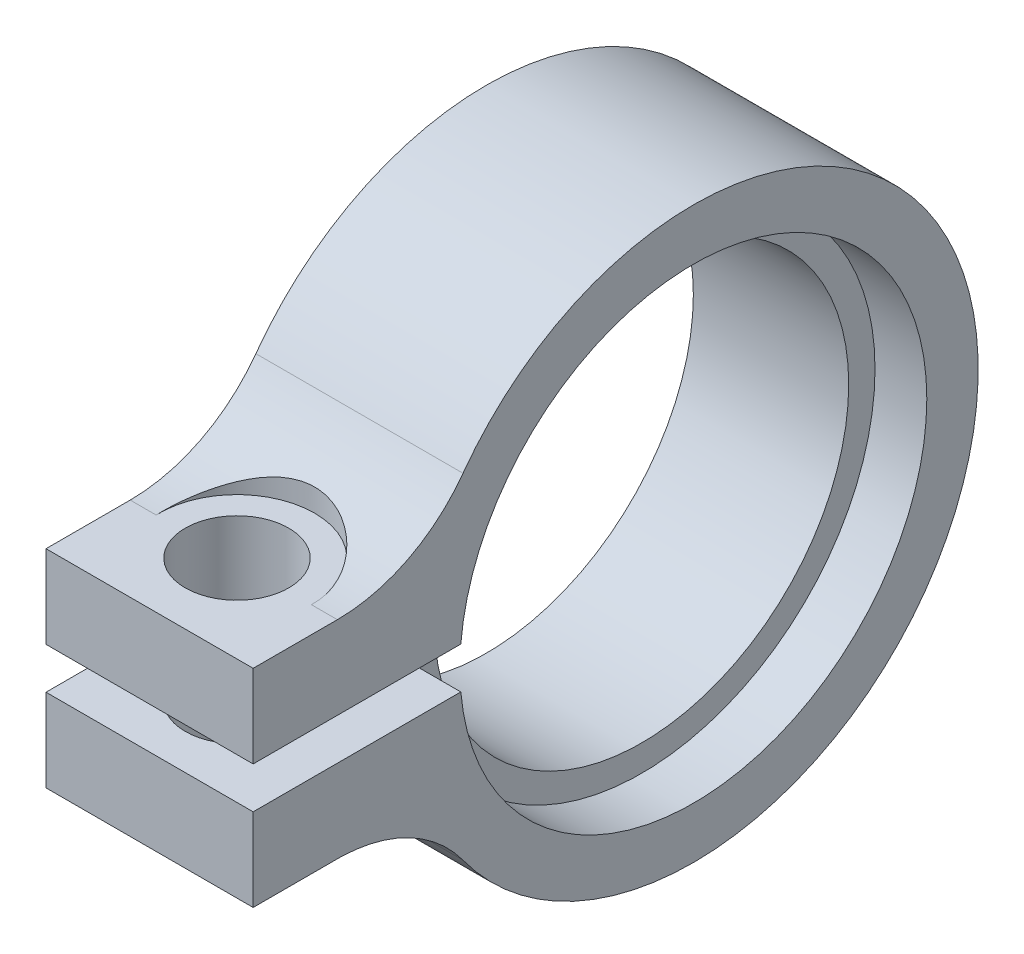
ISO-10303-21;
HEADER;
FILE_DESCRIPTION(('STEP AP214'),'2;1');
FILE_NAME('part.step','',(''),(''),'','','');
FILE_SCHEMA(('AUTOMOTIVE_DESIGN { 1 0 10303 214 1 1 1 1 }'));
ENDSEC;
DATA;
#1=APPLICATION_CONTEXT('core data for automotive mechanical design processes');
#2=APPLICATION_PROTOCOL_DEFINITION('international standard','automotive_design',2000,#1);
#3=PRODUCT_CONTEXT('',#1,'mechanical');
#4=PRODUCT('Part','Part','',(#3));
#5=PRODUCT_RELATED_PRODUCT_CATEGORY('part','',(#4));
#6=PRODUCT_DEFINITION_FORMATION('','',#4);
#7=PRODUCT_DEFINITION_CONTEXT('part definition',#1,'design');
#8=PRODUCT_DEFINITION('design','',#6,#7);
#9=PRODUCT_DEFINITION_SHAPE('','',#8);
#10=(LENGTH_UNIT() NAMED_UNIT(*) SI_UNIT(.MILLI.,.METRE.));
#11=(NAMED_UNIT(*) PLANE_ANGLE_UNIT() SI_UNIT($,.RADIAN.));
#12=(NAMED_UNIT(*) SI_UNIT($,.STERADIAN.) SOLID_ANGLE_UNIT());
#13=UNCERTAINTY_MEASURE_WITH_UNIT(LENGTH_MEASURE(1.E-05),#10,'distance_accuracy_value','');
#14=(GEOMETRIC_REPRESENTATION_CONTEXT(3) GLOBAL_UNCERTAINTY_ASSIGNED_CONTEXT((#13)) GLOBAL_UNIT_ASSIGNED_CONTEXT((#10,
#11,#12)) REPRESENTATION_CONTEXT('',''));
#15=CARTESIAN_POINT('',(0.,0.,0.));
#16=DIRECTION('',(0.,0.,1.));
#17=DIRECTION('',(1.,0.,0.));
#18=AXIS2_PLACEMENT_3D('',#15,#16,#17);
#19=CARTESIAN_POINT('',(-60.325,0.,0.));
#20=DIRECTION('',(-1.,0.,0.));
#21=DIRECTION('',(0.,0.,1.));
#22=AXIS2_PLACEMENT_3D('',#19,#20,#21);
#23=PLANE('',#22);
#24=DIRECTION('',(0.,0.,-1.));
#25=VECTOR('',#24,1.);
#26=CARTESIAN_POINT('',(-60.325,181.1,0.));
#27=LINE('',#26,#25);
#28=CARTESIAN_POINT('',(-60.325,181.1,21.741244542418));
#29=VERTEX_POINT('',#28);
#30=CARTESIAN_POINT('',(-60.325,181.1,21.5132897985428));
#31=VERTEX_POINT('',#30);
#32=EDGE_CURVE('E188',#29,#31,#27,.T.);
#33=ORIENTED_EDGE('',*,*,#32,.F.);
#34=DIRECTION('',(0.,1.,0.));
#35=VECTOR('',#34,1.);
#36=CARTESIAN_POINT('',(-60.325,169.9875,21.741244542418));
#37=LINE('',#36,#35);
#38=CARTESIAN_POINT('',(-60.325,181.09963598989,21.741244542418));
#39=VERTEX_POINT('',#38);
#40=EDGE_CURVE('E171',#39,#29,#37,.T.);
#41=ORIENTED_EDGE('',*,*,#40,.F.);
#42=CARTESIAN_POINT('',(-60.325,171.575,21.8245167472272));
#43=DIRECTION('',(-1.,0.,0.));
#44=DIRECTION('',(0.,0.,1.));
#45=AXIS2_PLACEMENT_3D('',#42,#43,#44);
#46=CIRCLE('',#45,9.525);
#47=CARTESIAN_POINT('',(-60.325,181.1,21.8245167472272));
#48=VERTEX_POINT('',#47);
#49=EDGE_CURVE('E318',#39,#48,#46,.F.);
#50=ORIENTED_EDGE('',*,*,#49,.T.);
#51=DIRECTION('',(0.,0.,-1.));
#52=VECTOR('',#51,1.);
#53=CARTESIAN_POINT('',(-60.325,181.1,0.));
#54=LINE('',#53,#52);
#55=CARTESIAN_POINT('',(-60.325,181.1,26.9875));
#56=VERTEX_POINT('',#55);
#57=EDGE_CURVE('E278',#56,#48,#54,.T.);
#58=ORIENTED_EDGE('',*,*,#57,.F.);
#59=DIRECTION('',(0.,-1.,0.));
#60=VECTOR('',#59,1.);
#61=CARTESIAN_POINT('',(-60.325,0.,26.9875));
#62=LINE('',#61,#60);
#63=CARTESIAN_POINT('',(-60.325,186.18,26.9875));
#64=VERTEX_POINT('',#63);
#65=EDGE_CURVE('E280',#64,#56,#62,.T.);
#66=ORIENTED_EDGE('',*,*,#65,.F.);
#67=DIRECTION('',(0.,0.,1.));
#68=VECTOR('',#67,1.);
#69=CARTESIAN_POINT('',(-60.325,186.18,0.));
#70=LINE('',#69,#68);
#71=CARTESIAN_POINT('',(-60.325,186.18,12.6363404512541));
#72=VERTEX_POINT('',#71);
#73=EDGE_CURVE('E283',#72,#64,#70,.T.);
#74=ORIENTED_EDGE('',*,*,#73,.F.);
#75=CARTESIAN_POINT('',(-60.325,187.45,0.));
#76=DIRECTION('',(-1.,0.,0.));
#77=DIRECTION('',(0.,0.,1.));
#78=AXIS2_PLACEMENT_3D('',#75,#76,#77);
#79=CIRCLE('',#78,12.7);
#80=CARTESIAN_POINT('',(-60.325,188.72,12.6363404512541));
#81=VERTEX_POINT('',#80);
#82=EDGE_CURVE('E265',#72,#81,#79,.F.);
#83=ORIENTED_EDGE('',*,*,#82,.T.);
#84=DIRECTION('',(0.,0.,1.));
#85=VECTOR('',#84,1.);
#86=CARTESIAN_POINT('',(-60.325,188.72,0.));
#87=LINE('',#86,#85);
#88=CARTESIAN_POINT('',(-60.325,188.72,26.9875));
#89=VERTEX_POINT('',#88);
#90=EDGE_CURVE('E268',#81,#89,#87,.T.);
#91=ORIENTED_EDGE('',*,*,#90,.T.);
#92=DIRECTION('',(0.,1.,0.));
#93=VECTOR('',#92,1.);
#94=CARTESIAN_POINT('',(-60.325,0.,26.9875));
#95=LINE('',#94,#93);
#96=CARTESIAN_POINT('',(-60.325,193.8,26.9875));
#97=VERTEX_POINT('',#96);
#98=EDGE_CURVE('E271',#89,#97,#95,.T.);
#99=ORIENTED_EDGE('',*,*,#98,.T.);
#100=DIRECTION('',(0.,0.,-1.));
#101=VECTOR('',#100,1.);
#102=CARTESIAN_POINT('',(-60.325,193.8,0.));
#103=LINE('',#102,#101);
#104=CARTESIAN_POINT('',(-60.325,193.8,21.8245167472272));
#105=VERTEX_POINT('',#104);
#106=EDGE_CURVE('E273',#97,#105,#103,.T.);
#107=ORIENTED_EDGE('',*,*,#106,.T.);
#108=CARTESIAN_POINT('',(-60.325,203.325,21.8245167472272));
#109=DIRECTION('',(-1.,0.,0.));
#110=DIRECTION('',(0.,0.,1.));
#111=AXIS2_PLACEMENT_3D('',#108,#109,#110);
#112=CIRCLE('',#111,9.525);
#113=CARTESIAN_POINT('',(-60.325,197.722058823529,14.1217461305588));
#114=VERTEX_POINT('',#113);
#115=EDGE_CURVE('E323',#105,#114,#112,.F.);
#116=ORIENTED_EDGE('',*,*,#115,.T.);
#117=CARTESIAN_POINT('',(-60.325,187.45,0.));
#118=DIRECTION('',(-1.,0.,0.));
#119=DIRECTION('',(0.,0.,1.));
#120=AXIS2_PLACEMENT_3D('',#117,#118,#119);
#121=CIRCLE('',#120,17.4625);
#122=CARTESIAN_POINT('',(-60.325,177.177941176471,14.1217461305588));
#123=VERTEX_POINT('',#122);
#124=EDGE_CURVE('E275',#114,#123,#121,.T.);
#125=ORIENTED_EDGE('',*,*,#124,.T.);
#126=CARTESIAN_POINT('',(-60.325,181.094914011503,21.5132897985428));
#127=VERTEX_POINT('',#126);
#128=EDGE_CURVE('E319',#123,#127,#46,.F.);
#129=ORIENTED_EDGE('',*,*,#128,.T.);
#130=DIRECTION('',(0.,1.,0.));
#131=VECTOR('',#130,1.);
#132=CARTESIAN_POINT('',(-60.325,169.9875,21.5132897985428));
#133=LINE('',#132,#131);
#134=EDGE_CURVE('E180',#127,#31,#133,.T.);
#135=ORIENTED_EDGE('',*,*,#134,.T.);
#136=EDGE_LOOP('',(#33,#41,#50,#58,#66,#74,#83,#91,#99,#107,#116,#125,#129,#135));
#137=FACE_BOUND('',#136,.T.);
#138=ADVANCED_FACE('F35',(#137),#23,.T.);
#139=CARTESIAN_POINT('',(-47.625,187.45,0.));
#140=DIRECTION('',(1.,0.,0.));
#141=DIRECTION('',(0.,0.,-1.));
#142=AXIS2_PLACEMENT_3D('',#139,#140,#141);
#143=PLANE('',#142);
#144=CARTESIAN_POINT('',(-47.625,171.575,21.8245167472272));
#145=DIRECTION('',(1.,0.,0.));
#146=DIRECTION('',(0.,0.,-1.));
#147=AXIS2_PLACEMENT_3D('',#144,#145,#146);
#148=CIRCLE('',#147,9.525);
#149=CARTESIAN_POINT('',(-47.625,181.1,21.8245167472272));
#150=VERTEX_POINT('',#149);
#151=CARTESIAN_POINT('',(-47.625,181.09963598989,21.7412445424181));
#152=VERTEX_POINT('',#151);
#153=EDGE_CURVE('E315',#150,#152,#148,.F.);
#154=ORIENTED_EDGE('',*,*,#153,.T.);
#155=DIRECTION('',(0.,1.,0.));
#156=VECTOR('',#155,1.);
#157=CARTESIAN_POINT('',(-47.625,169.9875,21.7412445424181));
#158=LINE('',#157,#156);
#159=CARTESIAN_POINT('',(-47.625,181.1,21.7412445424181));
#160=VERTEX_POINT('',#159);
#161=EDGE_CURVE('E210',#152,#160,#158,.T.);
#162=ORIENTED_EDGE('',*,*,#161,.T.);
#163=DIRECTION('',(0.,0.,1.));
#164=VECTOR('',#163,1.);
#165=CARTESIAN_POINT('',(-47.625,181.1,0.));
#166=LINE('',#165,#164);
#167=CARTESIAN_POINT('',(-47.625,181.1,21.5132897985427));
#168=VERTEX_POINT('',#167);
#169=EDGE_CURVE('E208',#168,#160,#166,.T.);
#170=ORIENTED_EDGE('',*,*,#169,.F.);
#171=DIRECTION('',(0.,1.,0.));
#172=VECTOR('',#171,1.);
#173=CARTESIAN_POINT('',(-47.625,169.9875,21.5132897985427));
#174=LINE('',#173,#172);
#175=CARTESIAN_POINT('',(-47.625,181.094914011503,21.5132897985427));
#176=VERTEX_POINT('',#175);
#177=EDGE_CURVE('E213',#176,#168,#174,.T.);
#178=ORIENTED_EDGE('',*,*,#177,.F.);
#179=CARTESIAN_POINT('',(-47.625,177.177941176471,14.1217461305588));
#180=VERTEX_POINT('',#179);
#181=EDGE_CURVE('E314',#176,#180,#148,.F.);
#182=ORIENTED_EDGE('',*,*,#181,.T.);
#183=CARTESIAN_POINT('',(-47.625,187.45,0.));
#184=DIRECTION('',(1.,0.,0.));
#185=DIRECTION('',(0.,0.,-1.));
#186=AXIS2_PLACEMENT_3D('',#183,#184,#185);
#187=CIRCLE('',#186,17.4625);
#188=CARTESIAN_POINT('',(-47.625,197.722058823529,14.1217461305588));
#189=VERTEX_POINT('',#188);
#190=EDGE_CURVE('E255',#189,#180,#187,.F.);
#191=ORIENTED_EDGE('',*,*,#190,.F.);
#192=CARTESIAN_POINT('',(-47.625,203.325,21.8245167472272));
#193=DIRECTION('',(1.,0.,0.));
#194=DIRECTION('',(0.,0.,-1.));
#195=AXIS2_PLACEMENT_3D('',#192,#193,#194);
#196=CIRCLE('',#195,9.525);
#197=CARTESIAN_POINT('',(-47.625,193.8,21.8245167472272));
#198=VERTEX_POINT('',#197);
#199=EDGE_CURVE('E321',#189,#198,#196,.F.);
#200=ORIENTED_EDGE('',*,*,#199,.T.);
#201=DIRECTION('',(0.,0.,-1.));
#202=VECTOR('',#201,1.);
#203=CARTESIAN_POINT('',(-47.625,193.8,0.));
#204=LINE('',#203,#202);
#205=CARTESIAN_POINT('',(-47.625,193.8,26.9875));
#206=VERTEX_POINT('',#205);
#207=EDGE_CURVE('E241',#206,#198,#204,.T.);
#208=ORIENTED_EDGE('',*,*,#207,.F.);
#209=DIRECTION('',(0.,1.,0.));
#210=VECTOR('',#209,1.);
#211=CARTESIAN_POINT('',(-47.625,0.,26.9875));
#212=LINE('',#211,#210);
#213=CARTESIAN_POINT('',(-47.625,188.72,26.9875));
#214=VERTEX_POINT('',#213);
#215=EDGE_CURVE('E238',#214,#206,#212,.T.);
#216=ORIENTED_EDGE('',*,*,#215,.F.);
#217=DIRECTION('',(0.,0.,1.));
#218=VECTOR('',#217,1.);
#219=CARTESIAN_POINT('',(-47.625,188.72,0.));
#220=LINE('',#219,#218);
#221=CARTESIAN_POINT('',(-47.625,188.72,14.2564443817524));
#222=VERTEX_POINT('',#221);
#223=EDGE_CURVE('E236',#222,#214,#220,.T.);
#224=ORIENTED_EDGE('',*,*,#223,.F.);
#225=CARTESIAN_POINT('',(-47.625,187.45,0.));
#226=DIRECTION('',(1.,0.,0.));
#227=DIRECTION('',(0.,0.,-1.));
#228=AXIS2_PLACEMENT_3D('',#225,#226,#227);
#229=CIRCLE('',#228,14.3129);
#230=CARTESIAN_POINT('',(-47.625,186.18,14.2564443817524));
#231=VERTEX_POINT('',#230);
#232=EDGE_CURVE('E232',#222,#231,#229,.F.);
#233=ORIENTED_EDGE('',*,*,#232,.T.);
#234=DIRECTION('',(0.,0.,1.));
#235=VECTOR('',#234,1.);
#236=CARTESIAN_POINT('',(-47.625,186.18,0.));
#237=LINE('',#236,#235);
#238=CARTESIAN_POINT('',(-47.625,186.18,26.9875));
#239=VERTEX_POINT('',#238);
#240=EDGE_CURVE('E247',#231,#239,#237,.T.);
#241=ORIENTED_EDGE('',*,*,#240,.T.);
#242=DIRECTION('',(0.,-1.,0.));
#243=VECTOR('',#242,1.);
#244=CARTESIAN_POINT('',(-47.625,0.,26.9875));
#245=LINE('',#244,#243);
#246=CARTESIAN_POINT('',(-47.625,181.1,26.9875));
#247=VERTEX_POINT('',#246);
#248=EDGE_CURVE('E250',#239,#247,#245,.T.);
#249=ORIENTED_EDGE('',*,*,#248,.T.);
#250=DIRECTION('',(0.,0.,-1.));
#251=VECTOR('',#250,1.);
#252=CARTESIAN_POINT('',(-47.625,181.1,0.));
#253=LINE('',#252,#251);
#254=EDGE_CURVE('E242',#247,#150,#253,.T.);
#255=ORIENTED_EDGE('',*,*,#254,.T.);
#256=EDGE_LOOP('',(#154,#162,#170,#178,#182,#191,#200,#208,#216,#224,#233,#241,#249,#255));
#257=FACE_BOUND('',#256,.T.);
#258=ADVANCED_FACE('F348',(#257),#143,.T.);
#259=CARTESIAN_POINT('',(-60.325,171.575,21.8245167472272));
#260=DIRECTION('',(1.,0.,0.));
#261=DIRECTION('',(0.,0.,-1.));
#262=AXIS2_PLACEMENT_3D('',#259,#260,#261);
#263=CYLINDRICAL_SURFACE('',#262,9.525);
#264=CARTESIAN_POINT('',(-47.6730772298625,171.575,21.8245167472272));
#265=DIRECTION('',(-0.866025403784439,0.,-0.5));
#266=DIRECTION('',(0.5,0.,-0.866025403784439));
#267=AXIS2_PLACEMENT_3D('',#264,#265,#266);
#268=ELLIPSE('',#267,10.9985226280624,9.525);
#269=CARTESIAN_POINT('',(-47.6730772298626,181.1,21.8245167472272));
#270=VERTEX_POINT('',#269);
#271=EDGE_CURVE('E11',#152,#270,#268,.F.);
#272=ORIENTED_EDGE('',*,*,#271,.F.);
#273=ORIENTED_EDGE('',*,*,#153,.F.);
#274=DIRECTION('',(1.,0.,0.));
#275=VECTOR('',#274,1.);
#276=CARTESIAN_POINT('',(-60.325,181.1,21.8245167472272));
#277=LINE('',#276,#275);
#278=EDGE_CURVE('E305',#270,#150,#277,.T.);
#279=ORIENTED_EDGE('',*,*,#278,.F.);
#280=EDGE_LOOP('',(#272,#273,#279));
#281=FACE_BOUND('',#280,.T.);
#282=ADVANCED_FACE('F351',(#281),#263,.F.);
#283=CARTESIAN_POINT('',(-60.2769227701374,171.575,21.8245167472272));
#284=DIRECTION('',(0.866025403784439,0.,-0.499999999999999));
#285=DIRECTION('',(0.499999999999999,0.,0.866025403784439));
#286=AXIS2_PLACEMENT_3D('',#283,#284,#285);
#287=ELLIPSE('',#286,10.9985226280624,9.525);
#288=CARTESIAN_POINT('',(-60.2769227701374,181.1,21.8245167472272));
#289=VERTEX_POINT('',#288);
#290=EDGE_CURVE('E44',#289,#39,#287,.F.);
#291=ORIENTED_EDGE('',*,*,#290,.F.);
#292=EDGE_CURVE('E192',#48,#289,#277,.T.);
#293=ORIENTED_EDGE('',*,*,#292,.F.);
#294=ORIENTED_EDGE('',*,*,#49,.F.);
#295=EDGE_LOOP('',(#291,#293,#294));
#296=FACE_BOUND('',#295,.T.);
#297=ADVANCED_FACE('F388',(#296),#263,.F.);
#298=CARTESIAN_POINT('',(-60.504686962602,171.575,21.8245167472272));
#299=DIRECTION('',(0.866025403784439,0.,0.5));
#300=DIRECTION('',(0.5,0.,-0.866025403784439));
#301=AXIS2_PLACEMENT_3D('',#298,#299,#300);
#302=ELLIPSE('',#301,10.9985226280624,9.525);
#303=CARTESIAN_POINT('',(-57.2960729993275,179.310632766881,16.2670343409609));
#304=VERTEX_POINT('',#303);
#305=EDGE_CURVE('E405',#127,#304,#302,.F.);
#306=ORIENTED_EDGE('',*,*,#305,.F.);
#307=ORIENTED_EDGE('',*,*,#128,.F.);
#308=DIRECTION('',(1.,0.,0.));
#309=VECTOR('',#308,1.);
#310=CARTESIAN_POINT('',(-60.325,177.177941176471,14.1217461305588));
#311=LINE('',#310,#309);
#312=EDGE_CURVE('E310',#180,#123,#311,.F.);
#313=ORIENTED_EDGE('',*,*,#312,.F.);
#314=ORIENTED_EDGE('',*,*,#181,.F.);
#315=CARTESIAN_POINT('',(-47.445313037398,171.575,21.8245167472272));
#316=DIRECTION('',(-0.866025403784438,0.,0.5));
#317=DIRECTION('',(0.5,0.,0.866025403784439));
#318=AXIS2_PLACEMENT_3D('',#315,#316,#317);
#319=ELLIPSE('',#318,10.9985226280624,9.525);
#320=CARTESIAN_POINT('',(-50.6539270006725,179.310632766881,16.2670343409609));
#321=VERTEX_POINT('',#320);
#322=EDGE_CURVE('E332',#321,#176,#319,.F.);
#323=ORIENTED_EDGE('',*,*,#322,.F.);
#324=DIRECTION('',(1.,0.,0.));
#325=VECTOR('',#324,1.);
#326=CARTESIAN_POINT('',(-60.325,179.310632766881,16.2670343409609));
#327=LINE('',#326,#325);
#328=EDGE_CURVE('E408',#304,#321,#327,.T.);
#329=ORIENTED_EDGE('',*,*,#328,.F.);
#330=EDGE_LOOP('',(#306,#307,#313,#314,#323,#329));
#331=FACE_BOUND('',#330,.T.);
#332=ADVANCED_FACE('F390',(#331),#263,.F.);
#333=CARTESIAN_POINT('',(-53.975,169.9875,21.6272671704804));
#334=DIRECTION('',(0.,1.,0.));
#335=DIRECTION('',(0.,0.,1.));
#336=AXIS2_PLACEMENT_3D('',#333,#334,#335);
#337=CYLINDRICAL_SURFACE('',#336,3.175);
#338=CARTESIAN_POINT('',(-53.975,186.18,21.6272671704804));
#339=DIRECTION('',(0.,1.,0.));
#340=DIRECTION('',(0.,0.,1.));
#341=AXIS2_PLACEMENT_3D('',#338,#339,#340);
#342=CIRCLE('',#341,3.175);
#343=CARTESIAN_POINT('',(-53.975,186.18,24.8022671704804));
#344=VERTEX_POINT('',#343);
#345=EDGE_CURVE('E225',#344,#344,#342,.T.);
#346=CARTESIAN_POINT('',(-53.975,181.1,21.6272671704804));
#347=DIRECTION('',(0.,-1.,0.));
#348=DIRECTION('',(0.,0.,-1.));
#349=AXIS2_PLACEMENT_3D('',#346,#347,#348);
#350=CIRCLE('',#349,3.175);
#351=CARTESIAN_POINT('',(-53.975,181.1,24.8022671704804));
#352=VERTEX_POINT('',#351);
#353=EDGE_CURVE('E222',#352,#352,#350,.T.);
#354=CARTESIAN_POINT('',(-53.975,186.18,24.8022671704804));
#355=CARTESIAN_POINT('',(-53.975,186.127083333333,24.8022671704804));
#356=CARTESIAN_POINT('',(-53.975,186.074166666667,24.8022671704804));
#357=CARTESIAN_POINT('',(-53.975,185.968333333333,24.8022671704804));
#358=CARTESIAN_POINT('',(-53.975,185.915416666667,24.8022671704804));
#359=CARTESIAN_POINT('',(-53.975,185.809583333333,24.8022671704804));
#360=CARTESIAN_POINT('',(-53.975,185.756666666667,24.8022671704804));
#361=CARTESIAN_POINT('',(-53.975,185.650833333333,24.8022671704804));
#362=CARTESIAN_POINT('',(-53.975,185.597916666667,24.8022671704804));
#363=CARTESIAN_POINT('',(-53.975,185.492083333333,24.8022671704804));
#364=CARTESIAN_POINT('',(-53.975,185.439166666667,24.8022671704804));
#365=CARTESIAN_POINT('',(-53.975,185.333333333333,24.8022671704804));
#366=CARTESIAN_POINT('',(-53.975,185.280416666667,24.8022671704804));
#367=CARTESIAN_POINT('',(-53.975,185.174583333333,24.8022671704804));
#368=CARTESIAN_POINT('',(-53.975,185.121666666667,24.8022671704804));
#369=CARTESIAN_POINT('',(-53.975,185.015833333333,24.8022671704804));
#370=CARTESIAN_POINT('',(-53.975,184.962916666667,24.8022671704804));
#371=CARTESIAN_POINT('',(-53.975,184.857083333333,24.8022671704804));
#372=CARTESIAN_POINT('',(-53.975,184.804166666667,24.8022671704804));
#373=CARTESIAN_POINT('',(-53.975,184.698333333333,24.8022671704804));
#374=CARTESIAN_POINT('',(-53.975,184.645416666667,24.8022671704804));
#375=CARTESIAN_POINT('',(-53.975,184.539583333333,24.8022671704804));
#376=CARTESIAN_POINT('',(-53.975,184.486666666667,24.8022671704804));
#377=CARTESIAN_POINT('',(-53.975,184.380833333333,24.8022671704804));
#378=CARTESIAN_POINT('',(-53.975,184.327916666667,24.8022671704804));
#379=CARTESIAN_POINT('',(-53.975,184.222083333333,24.8022671704804));
#380=CARTESIAN_POINT('',(-53.975,184.169166666667,24.8022671704804));
#381=CARTESIAN_POINT('',(-53.975,184.063333333333,24.8022671704804));
#382=CARTESIAN_POINT('',(-53.975,184.010416666667,24.8022671704804));
#383=CARTESIAN_POINT('',(-53.975,183.904583333333,24.8022671704804));
#384=CARTESIAN_POINT('',(-53.975,183.851666666667,24.8022671704804));
#385=CARTESIAN_POINT('',(-53.975,183.745833333333,24.8022671704804));
#386=CARTESIAN_POINT('',(-53.975,183.692916666667,24.8022671704804));
#387=CARTESIAN_POINT('',(-53.975,183.587083333333,24.8022671704804));
#388=CARTESIAN_POINT('',(-53.975,183.534166666667,24.8022671704804));
#389=CARTESIAN_POINT('',(-53.975,183.428333333333,24.8022671704804));
#390=CARTESIAN_POINT('',(-53.975,183.375416666667,24.8022671704804));
#391=CARTESIAN_POINT('',(-53.975,183.269583333333,24.8022671704804));
#392=CARTESIAN_POINT('',(-53.975,183.216666666667,24.8022671704804));
#393=CARTESIAN_POINT('',(-53.975,183.110833333333,24.8022671704804));
#394=CARTESIAN_POINT('',(-53.975,183.057916666667,24.8022671704804));
#395=CARTESIAN_POINT('',(-53.975,182.952083333333,24.8022671704804));
#396=CARTESIAN_POINT('',(-53.975,182.899166666667,24.8022671704804));
#397=CARTESIAN_POINT('',(-53.975,182.793333333333,24.8022671704804));
#398=CARTESIAN_POINT('',(-53.975,182.740416666667,24.8022671704804));
#399=CARTESIAN_POINT('',(-53.975,182.634583333333,24.8022671704804));
#400=CARTESIAN_POINT('',(-53.975,182.581666666667,24.8022671704804));
#401=CARTESIAN_POINT('',(-53.975,182.475833333333,24.8022671704804));
#402=CARTESIAN_POINT('',(-53.975,182.422916666667,24.8022671704804));
#403=CARTESIAN_POINT('',(-53.975,182.317083333333,24.8022671704804));
#404=CARTESIAN_POINT('',(-53.975,182.264166666667,24.8022671704804));
#405=CARTESIAN_POINT('',(-53.975,182.158333333333,24.8022671704804));
#406=CARTESIAN_POINT('',(-53.975,182.105416666667,24.8022671704804));
#407=CARTESIAN_POINT('',(-53.975,181.999583333333,24.8022671704804));
#408=CARTESIAN_POINT('',(-53.975,181.946666666667,24.8022671704804));
#409=CARTESIAN_POINT('',(-53.975,181.840833333333,24.8022671704804));
#410=CARTESIAN_POINT('',(-53.975,181.787916666667,24.8022671704804));
#411=CARTESIAN_POINT('',(-53.975,181.682083333333,24.8022671704804));
#412=CARTESIAN_POINT('',(-53.975,181.629166666667,24.8022671704804));
#413=CARTESIAN_POINT('',(-53.975,181.523333333333,24.8022671704804));
#414=CARTESIAN_POINT('',(-53.975,181.470416666667,24.8022671704804));
#415=CARTESIAN_POINT('',(-53.975,181.364583333333,24.8022671704804));
#416=CARTESIAN_POINT('',(-53.975,181.311666666667,24.8022671704804));
#417=CARTESIAN_POINT('',(-53.975,181.205833333333,24.8022671704804));
#418=CARTESIAN_POINT('',(-53.975,181.152916666667,24.8022671704804));
#419=CARTESIAN_POINT('',(-53.975,181.1,24.8022671704804));
#420=B_SPLINE_CURVE_WITH_KNOTS('',3,(#354,#355,#356,#357,#358,#359,#360,#361,#362,#363,#364,
#365,#366,#367,#368,#369,#370,#371,#372,#373,#374,#375,#376,#377,#378,#379,#380,#381,#382,#383,
#384,#385,#386,#387,#388,#389,#390,#391,#392,#393,#394,#395,#396,#397,#398,#399,#400,#401,#402,
#403,#404,#405,#406,#407,#408,#409,#410,#411,#412,#413,#414,#415,#416,#417,#418,#419),
.UNSPECIFIED.,.F.,.F.,(4,2,2,2,2,2,2,2,2,2,2,2,2,2,2,2,2,2,2,2,2,2,2,2,2,2,2,2,2,2,2,2,4),(0.,
0.158750000000013,0.317500000000026,0.476250000000011,0.634999999999997,0.79375000000001,
0.952500000000023,1.11125000000001,1.26999999999999,1.42875000000001,1.58750000000002,1.74625,
1.90499999999999,2.06375,2.22250000000002,2.38125,2.53999999999999,2.69875,2.85750000000001,
3.01625,3.17499999999998,3.33375,3.49250000000001,3.65124999999999,3.80999999999998,
3.96874999999999,4.12750000000001,4.28624999999999,4.44499999999998,4.60374999999999,4.7625,
4.92124999999999,5.07999999999997),.UNSPECIFIED.);
#421=EDGE_CURVE('BSEAM342',#344,#352,#420,.T.);
#422=ORIENTED_EDGE('',*,*,#345,.T.);
#423=ORIENTED_EDGE('',*,*,#353,.T.);
#424=ORIENTED_EDGE('',*,*,#421,.T.);
#425=ORIENTED_EDGE('',*,*,#421,.F.);
#426=EDGE_LOOP('',(#422,#424,#423,#425));
#427=FACE_BOUND('',#426,.T.);
#428=ADVANCED_FACE('F342',(#427),#337,.F.);
#429=CARTESIAN_POINT('',(-60.325,203.325,21.8245167472272));
#430=DIRECTION('',(1.,0.,0.));
#431=DIRECTION('',(0.,0.,-1.));
#432=AXIS2_PLACEMENT_3D('',#429,#430,#431);
#433=CYLINDRICAL_SURFACE('',#432,9.525);
#434=CARTESIAN_POINT('',(-49.2165865191775,193.8,21.8245167472272));
#435=CARTESIAN_POINT('',(-49.2113798883409,193.799976979506,21.6994279858251));
#436=CARTESIAN_POINT('',(-49.2111478551584,193.802463253055,21.5741421372694));
#437=CARTESIAN_POINT('',(-49.2205153300727,193.812334411973,21.3241769270589));
#438=CARTESIAN_POINT('',(-49.2301112192154,193.819717493829,21.1994973591324));
#439=CARTESIAN_POINT('',(-49.2589484564399,193.839218651993,20.9522072787238));
#440=CARTESIAN_POINT('',(-49.2781463823023,193.851315358479,20.8295899974846));
#441=CARTESIAN_POINT('',(-49.3259142678482,193.879977564969,20.5867270905322));
#442=CARTESIAN_POINT('',(-49.3544847076214,193.896543293882,20.4664815866435));
#443=CARTESIAN_POINT('',(-49.4206318700593,193.933762462466,20.2293149365534));
#444=CARTESIAN_POINT('',(-49.4581968093501,193.954410547868,20.112389662974));
#445=CARTESIAN_POINT('',(-49.5419660966628,193.999362998193,19.8823837963988));
#446=CARTESIAN_POINT('',(-49.5881737095267,194.023668744147,19.7693046754603));
#447=CARTESIAN_POINT('',(-49.739199771725,194.101356043203,19.4366877907483));
#448=CARTESIAN_POINT('',(-49.8564263533363,194.159510494288,19.2237531226647));
#449=CARTESIAN_POINT('',(-50.1280906677932,194.287484377845,18.8080507147676));
#450=CARTESIAN_POINT('',(-50.2843001530465,194.357786380459,18.6066006120412));
#451=CARTESIAN_POINT('',(-50.626145976685,194.501372490257,18.2315245761309));
#452=CARTESIAN_POINT('',(-50.8118029781896,194.574658664372,18.0579183541348));
#453=CARTESIAN_POINT('',(-51.2272311440646,194.724046031342,17.7275732274059));
#454=CARTESIAN_POINT('',(-51.4594620225749,194.799813396996,17.5737286684411));
#455=CARTESIAN_POINT('',(-51.8273142932308,194.903232803414,17.3742241273411));
#456=CARTESIAN_POINT('',(-51.9532415888135,194.936012664949,17.3129131875817));
#457=CARTESIAN_POINT('',(-52.21092243453,194.996998751889,17.2013081729987));
#458=CARTESIAN_POINT('',(-52.3426725218788,195.025207650254,17.1510076535319));
#459=CARTESIAN_POINT('',(-52.6049621998338,195.074768067776,17.0640870456544));
#460=CARTESIAN_POINT('',(-52.735281048358,195.096374411361,17.0269460575248));
#461=CARTESIAN_POINT('',(-52.9993750537808,195.133519732159,16.9637944370431));
#462=CARTESIAN_POINT('',(-53.1331482334561,195.1490621017,16.9377775808069));
#463=CARTESIAN_POINT('',(-53.4029203556697,195.17339977344,16.8972863408474));
#464=CARTESIAN_POINT('',(-53.5389172035236,195.182201089468,16.8828016685735));
#465=CARTESIAN_POINT('',(-53.8119200139767,195.192667084361,16.8655962878208));
#466=CARTESIAN_POINT('',(-53.9489258364508,195.194332736171,16.8628739755502));
#467=CARTESIAN_POINT('',(-54.2037305599964,195.190721992263,16.8687980553319));
#468=CARTESIAN_POINT('',(-54.3215813465496,195.186368215324,16.8759334096697));
#469=CARTESIAN_POINT('',(-54.5561603160805,195.17245398511,16.898889943693));
#470=CARTESIAN_POINT('',(-54.6728881384623,195.162891912685,16.9147138244708));
#471=CARTESIAN_POINT('',(-54.9043463967145,195.138884659994,16.9548467408952));
#472=CARTESIAN_POINT('',(-55.0190771150423,195.124440176262,16.9791545662214));
#473=CARTESIAN_POINT('',(-55.2458521748139,195.091136716168,17.035968137709));
#474=CARTESIAN_POINT('',(-55.3578954268661,195.072275981893,17.0684771487986));
#475=CARTESIAN_POINT('',(-55.6887508771256,195.009943203672,17.1777413061573));
#476=CARTESIAN_POINT('',(-55.9027005811172,194.960674643301,17.2663063334458));
#477=CARTESIAN_POINT('',(-56.3133858699408,194.851824064778,17.4720004681552));
#478=CARTESIAN_POINT('',(-56.5101141536577,194.792237703917,17.5891416116443));
#479=CARTESIAN_POINT('',(-56.9089482213873,194.659554329389,17.86693656413));
#480=CARTESIAN_POINT('',(-57.108211847601,194.585718413882,18.0313253688634));
#481=CARTESIAN_POINT('',(-57.4779070573367,194.438498510405,18.390380067616));
#482=CARTESIAN_POINT('',(-57.6483192884653,194.365114857339,18.5850661171703));
#483=CARTESIAN_POINT('',(-57.8853057692583,194.257671073398,18.9050600656331));
#484=CARTESIAN_POINT('',(-57.9635612107613,194.221063438523,19.0210344560634));
#485=CARTESIAN_POINT('',(-58.1099019734838,194.150865698781,19.2600734089787));
#486=CARTESIAN_POINT('',(-58.1779915512806,194.117274333326,19.3831349738938));
#487=CARTESIAN_POINT('',(-58.303293410404,194.054036455848,19.6355049030251));
#488=CARTESIAN_POINT('',(-58.3605152056072,194.024386500323,19.764807678013));
#489=CARTESIAN_POINT('',(-58.4634714732468,193.969830940308,20.028804034614));
#490=CARTESIAN_POINT('',(-58.5092126794887,193.944922556783,20.1634944021913));
#491=CARTESIAN_POINT('',(-58.5843597975278,193.902931264973,20.4225306999478));
#492=CARTESIAN_POINT('',(-58.6149932437973,193.8852949325,20.5464318920497));
#493=CARTESIAN_POINT('',(-58.6662834789537,193.854760781524,20.7968463897393));
#494=CARTESIAN_POINT('',(-58.6869417878418,193.841862241154,20.9233592942916));
#495=CARTESIAN_POINT('',(-58.7180744319476,193.821056791824,21.1786588892241));
#496=CARTESIAN_POINT('',(-58.7284997238127,193.813173984337,21.3074535465918));
#497=CARTESIAN_POINT('',(-58.7388636044855,193.802631169427,21.5657405988349));
#498=CARTESIAN_POINT('',(-58.7387968805882,193.799973808633,21.6952333139928));
#499=CARTESIAN_POINT('',(-58.7334134808225,193.8,21.8245167472272));
#500=B_SPLINE_CURVE_WITH_KNOTS('',3,(#434,#435,#436,#437,#438,#439,#440,#441,#442,#443,#444,
#445,#446,#447,#448,#449,#450,#451,#452,#453,#454,#455,#456,#457,#458,#459,#460,#461,#462,#463,
#464,#465,#466,#467,#468,#469,#470,#471,#472,#473,#474,#475,#476,#477,#478,#479,#480,#481,#482,
#483,#484,#485,#486,#487,#488,#489,#490,#491,#492,#493,#494,#495,#496,#497,#498,#499),
.UNSPECIFIED.,.F.,.F.,(4,2,2,2,2,2,2,2,2,2,2,2,2,2,2,2,2,2,2,2,2,2,2,2,2,2,2,2,2,2,2,2,4),(0.,
0.375453906741146,0.750769609078248,1.12440320401078,1.49805594062361,1.87122182088773,
2.24452895342299,2.99108900052263,3.78119831790891,4.57186452244996,5.43319786884767,
5.86423876740908,6.29502668948748,6.70609172412653,7.116926468477,7.52739427058006,
7.93780610384411,8.29181299057554,8.64592999346035,8.99999649860947,9.35420418223936,
10.0613720024351,10.7688381928027,11.5715562630129,12.3748106502105,12.808188500782,
13.2413843784992,13.6741992619295,14.1067596864472,14.4928140670276,14.8788096024614,
15.2666461790115,15.654679139929),.UNSPECIFIED.);
#501=CARTESIAN_POINT('',(-49.2165865191775,193.8,21.8245167472272));
#502=VERTEX_POINT('',#501);
#503=CARTESIAN_POINT('',(-58.7334134808225,193.8,21.8245167472272));
#504=VERTEX_POINT('',#503);
#505=EDGE_CURVE('E325',#502,#504,#500,.T.);
#506=ORIENTED_EDGE('',*,*,#505,.F.);
#507=DIRECTION('',(-1.,0.,0.));
#508=VECTOR('',#507,1.);
#509=CARTESIAN_POINT('',(-60.325,193.8,21.8245167472272));
#510=LINE('',#509,#508);
#511=EDGE_CURVE('E312',#198,#502,#510,.T.);
#512=ORIENTED_EDGE('',*,*,#511,.F.);
#513=ORIENTED_EDGE('',*,*,#199,.F.);
#514=DIRECTION('',(1.,0.,0.));
#515=VECTOR('',#514,1.);
#516=CARTESIAN_POINT('',(-60.325,197.722058823529,14.1217461305588));
#517=LINE('',#516,#515);
#518=EDGE_CURVE('E307',#114,#189,#517,.T.);
#519=ORIENTED_EDGE('',*,*,#518,.F.);
#520=ORIENTED_EDGE('',*,*,#115,.F.);
#521=EDGE_CURVE('E56',#504,#105,#510,.T.);
#522=ORIENTED_EDGE('',*,*,#521,.F.);
#523=EDGE_LOOP('',(#506,#512,#513,#519,#520,#522));
#524=FACE_BOUND('',#523,.T.);
#525=ADVANCED_FACE('F37',(#524),#433,.F.);
#526=CARTESIAN_POINT('',(-50.8,0.,0.));
#527=DIRECTION('',(-1.,0.,0.));
#528=DIRECTION('',(0.,0.,1.));
#529=AXIS2_PLACEMENT_3D('',#526,#527,#528);
#530=PLANE('',#529);
#531=CARTESIAN_POINT('',(-50.8,187.45,0.));
#532=DIRECTION('',(-1.,0.,0.));
#533=DIRECTION('',(0.,0.,1.));
#534=AXIS2_PLACEMENT_3D('',#531,#532,#533);
#535=CIRCLE('',#534,14.3129);
#536=CARTESIAN_POINT('',(-50.8,188.72,14.2564443817524));
#537=VERTEX_POINT('',#536);
#538=CARTESIAN_POINT('',(-50.8,186.18,14.2564443817524));
#539=VERTEX_POINT('',#538);
#540=EDGE_CURVE('E233',#537,#539,#535,.T.);
#541=ORIENTED_EDGE('',*,*,#540,.F.);
#542=DIRECTION('',(0.,0.,1.));
#543=VECTOR('',#542,1.);
#544=CARTESIAN_POINT('',(-50.8,188.72,0.));
#545=LINE('',#544,#543);
#546=CARTESIAN_POINT('',(-50.8,188.72,12.6363404512541));
#547=VERTEX_POINT('',#546);
#548=EDGE_CURVE('E289',#547,#537,#545,.T.);
#549=ORIENTED_EDGE('',*,*,#548,.F.);
#550=CARTESIAN_POINT('',(-50.8,187.45,0.));
#551=DIRECTION('',(-1.,0.,0.));
#552=DIRECTION('',(0.,0.,1.));
#553=AXIS2_PLACEMENT_3D('',#550,#551,#552);
#554=CIRCLE('',#553,12.7);
#555=CARTESIAN_POINT('',(-50.8,186.18,12.6363404512541));
#556=VERTEX_POINT('',#555);
#557=EDGE_CURVE('E245',#556,#547,#554,.F.);
#558=ORIENTED_EDGE('',*,*,#557,.F.);
#559=DIRECTION('',(0.,0.,1.));
#560=VECTOR('',#559,1.);
#561=CARTESIAN_POINT('',(-50.8,186.18,0.));
#562=LINE('',#561,#560);
#563=EDGE_CURVE('E269',#556,#539,#562,.T.);
#564=ORIENTED_EDGE('',*,*,#563,.T.);
#565=EDGE_LOOP('',(#541,#549,#558,#564));
#566=FACE_BOUND('',#565,.T.);
#567=ADVANCED_FACE('F355',(#566),#530,.F.);
#568=CARTESIAN_POINT('',(-60.325,187.45,0.));
#569=DIRECTION('',(1.,0.,0.));
#570=DIRECTION('',(0.,0.,-1.));
#571=AXIS2_PLACEMENT_3D('',#568,#569,#570);
#572=CYLINDRICAL_SURFACE('',#571,12.7);
#573=ORIENTED_EDGE('',*,*,#557,.T.);
#574=DIRECTION('',(1.,0.,0.));
#575=VECTOR('',#574,1.);
#576=CARTESIAN_POINT('',(-60.325,188.72,12.6363404512541));
#577=LINE('',#576,#575);
#578=EDGE_CURVE('E302',#81,#547,#577,.T.);
#579=ORIENTED_EDGE('',*,*,#578,.F.);
#580=ORIENTED_EDGE('',*,*,#82,.F.);
#581=DIRECTION('',(1.,0.,0.));
#582=VECTOR('',#581,1.);
#583=CARTESIAN_POINT('',(-60.325,186.18,12.6363404512541));
#584=LINE('',#583,#582);
#585=EDGE_CURVE('E286',#72,#556,#584,.T.);
#586=ORIENTED_EDGE('',*,*,#585,.T.);
#587=EDGE_LOOP('',(#573,#579,#580,#586));
#588=FACE_BOUND('',#587,.T.);
#589=ADVANCED_FACE('F358',(#588),#572,.F.);
#590=CARTESIAN_POINT('',(-60.325,188.72,0.));
#591=DIRECTION('',(0.,1.,0.));
#592=DIRECTION('',(0.,0.,1.));
#593=AXIS2_PLACEMENT_3D('',#590,#591,#592);
#594=PLANE('',#593);
#595=CARTESIAN_POINT('',(-53.975,188.72,21.6272671704804));
#596=DIRECTION('',(0.,1.,0.));
#597=DIRECTION('',(0.,0.,1.));
#598=AXIS2_PLACEMENT_3D('',#595,#596,#597);
#599=CIRCLE('',#598,3.175);
#600=CARTESIAN_POINT('',(-53.975,188.72,24.8022671704804));
#601=VERTEX_POINT('',#600);
#602=EDGE_CURVE('E228',#601,#601,#599,.T.);
#603=ORIENTED_EDGE('',*,*,#602,.T.);
#604=EDGE_LOOP('',(#603));
#605=FACE_BOUND('',#604,.T.);
#606=ORIENTED_EDGE('',*,*,#548,.T.);
#607=DIRECTION('',(-1.,0.,0.));
#608=VECTOR('',#607,1.);
#609=CARTESIAN_POINT('',(8.9042678618784,188.72,14.2564443817524));
#610=LINE('',#609,#608);
#611=EDGE_CURVE('E237',#222,#537,#610,.T.);
#612=ORIENTED_EDGE('',*,*,#611,.F.);
#613=ORIENTED_EDGE('',*,*,#223,.T.);
#614=DIRECTION('',(1.,0.,0.));
#615=VECTOR('',#614,1.);
#616=CARTESIAN_POINT('',(-60.325,188.72,26.9875));
#617=LINE('',#616,#615);
#618=EDGE_CURVE('E300',#89,#214,#617,.T.);
#619=ORIENTED_EDGE('',*,*,#618,.F.);
#620=ORIENTED_EDGE('',*,*,#90,.F.);
#621=ORIENTED_EDGE('',*,*,#578,.T.);
#622=EDGE_LOOP('',(#606,#612,#613,#619,#620,#621));
#623=FACE_BOUND('',#622,.T.);
#624=ADVANCED_FACE('F380',(#605,#623),#594,.F.);
#625=CARTESIAN_POINT('',(-60.325,0.,26.9875));
#626=DIRECTION('',(0.,0.,-1.));
#627=DIRECTION('',(-1.,0.,0.));
#628=AXIS2_PLACEMENT_3D('',#625,#626,#627);
#629=PLANE('',#628);
#630=ORIENTED_EDGE('',*,*,#618,.T.);
#631=ORIENTED_EDGE('',*,*,#215,.T.);
#632=DIRECTION('',(1.,0.,0.));
#633=VECTOR('',#632,1.);
#634=CARTESIAN_POINT('',(-60.325,193.8,26.9875));
#635=LINE('',#634,#633);
#636=EDGE_CURVE('E298',#97,#206,#635,.T.);
#637=ORIENTED_EDGE('',*,*,#636,.F.);
#638=ORIENTED_EDGE('',*,*,#98,.F.);
#639=EDGE_LOOP('',(#630,#631,#637,#638));
#640=FACE_BOUND('',#639,.T.);
#641=ADVANCED_FACE('F376',(#640),#629,.F.);
#642=CARTESIAN_POINT('',(-60.325,193.8,0.));
#643=DIRECTION('',(0.,-1.,0.));
#644=DIRECTION('',(0.,0.,-1.));
#645=AXIS2_PLACEMENT_3D('',#642,#643,#644);
#646=PLANE('',#645);
#647=CARTESIAN_POINT('',(-53.975,193.8,21.6272671704804));
#648=DIRECTION('',(0.,1.,0.));
#649=DIRECTION('',(0.,0.,1.));
#650=AXIS2_PLACEMENT_3D('',#647,#648,#649);
#651=CIRCLE('',#650,3.175);
#652=CARTESIAN_POINT('',(-53.975,193.8,24.8022671704804));
#653=VERTEX_POINT('',#652);
#654=EDGE_CURVE('E179',#653,#653,#651,.T.);
#655=ORIENTED_EDGE('',*,*,#654,.F.);
#656=EDGE_LOOP('',(#655));
#657=FACE_BOUND('',#656,.T.);
#658=ORIENTED_EDGE('',*,*,#511,.T.);
#659=CARTESIAN_POINT('',(-53.975,193.8,21.6272671704804));
#660=DIRECTION('',(0.,1.,0.));
#661=DIRECTION('',(0.,0.,1.));
#662=AXIS2_PLACEMENT_3D('',#659,#660,#661);
#663=CIRCLE('',#662,4.7625);
#664=EDGE_CURVE('E51',#502,#504,#663,.T.);
#665=ORIENTED_EDGE('',*,*,#664,.T.);
#666=ORIENTED_EDGE('',*,*,#521,.T.);
#667=ORIENTED_EDGE('',*,*,#106,.F.);
#668=ORIENTED_EDGE('',*,*,#636,.T.);
#669=ORIENTED_EDGE('',*,*,#207,.T.);
#670=EDGE_LOOP('',(#658,#665,#666,#667,#668,#669));
#671=FACE_BOUND('',#670,.T.);
#672=ADVANCED_FACE('F372',(#657,#671),#646,.F.);
#673=CARTESIAN_POINT('',(-60.325,187.45,0.));
#674=DIRECTION('',(1.,0.,0.));
#675=DIRECTION('',(0.,0.,-1.));
#676=AXIS2_PLACEMENT_3D('',#673,#674,#675);
#677=CYLINDRICAL_SURFACE('',#676,17.4625);
#678=ORIENTED_EDGE('',*,*,#190,.T.);
#679=ORIENTED_EDGE('',*,*,#312,.T.);
#680=ORIENTED_EDGE('',*,*,#124,.F.);
#681=ORIENTED_EDGE('',*,*,#518,.T.);
#682=EDGE_LOOP('',(#678,#679,#680,#681));
#683=FACE_BOUND('',#682,.T.);
#684=ADVANCED_FACE('F369',(#683),#677,.T.);
#685=CARTESIAN_POINT('',(-60.325,181.1,0.));
#686=DIRECTION('',(0.,-1.,0.));
#687=DIRECTION('',(0.,0.,-1.));
#688=AXIS2_PLACEMENT_3D('',#685,#686,#687);
#689=PLANE('',#688);
#690=DIRECTION('',(-0.5,0.,0.866025403784439));
#691=VECTOR('',#690,1.);
#692=CARTESIAN_POINT('',(-41.3857649581881,181.1,10.9345724496357));
#693=LINE('',#692,#691);
#694=EDGE_CURVE('E193',#160,#270,#693,.T.);
#695=ORIENTED_EDGE('',*,*,#694,.T.);
#696=ORIENTED_EDGE('',*,*,#278,.T.);
#697=ORIENTED_EDGE('',*,*,#254,.F.);
#698=DIRECTION('',(1.,0.,0.));
#699=VECTOR('',#698,1.);
#700=CARTESIAN_POINT('',(-60.325,181.1,26.9875));
#701=LINE('',#700,#699);
#702=EDGE_CURVE('E296',#56,#247,#701,.T.);
#703=ORIENTED_EDGE('',*,*,#702,.F.);
#704=ORIENTED_EDGE('',*,*,#57,.T.);
#705=ORIENTED_EDGE('',*,*,#292,.T.);
#706=DIRECTION('',(-0.499999999999999,0.,-0.866025403784439));
#707=VECTOR('',#706,1.);
#708=CARTESIAN_POINT('',(-69.7392350418119,181.1,5.43531113560449));
#709=LINE('',#708,#707);
#710=EDGE_CURVE('E174',#289,#29,#709,.T.);
#711=ORIENTED_EDGE('',*,*,#710,.T.);
#712=ORIENTED_EDGE('',*,*,#32,.T.);
#713=DIRECTION('',(0.5,0.,-0.866025403784439));
#714=VECTOR('',#713,1.);
#715=CARTESIAN_POINT('',(-51.0094722577427,181.1,5.37832244963571));
#716=LINE('',#715,#714);
#717=CARTESIAN_POINT('',(-57.2960729993275,181.1,16.2670343409609));
#718=VERTEX_POINT('',#717);
#719=EDGE_CURVE('E197',#31,#718,#716,.T.);
#720=ORIENTED_EDGE('',*,*,#719,.T.);
#721=DIRECTION('',(1.,0.,0.));
#722=VECTOR('',#721,1.);
#723=CARTESIAN_POINT('',(-60.325,181.1,16.2670343409609));
#724=LINE('',#723,#722);
#725=CARTESIAN_POINT('',(-50.6539270006725,181.1,16.2670343409609));
#726=VERTEX_POINT('',#725);
#727=EDGE_CURVE('E199',#718,#726,#724,.T.);
#728=ORIENTED_EDGE('',*,*,#727,.T.);
#729=DIRECTION('',(0.5,0.,0.866025403784439));
#730=VECTOR('',#729,1.);
#731=CARTESIAN_POINT('',(-60.1155277422573,181.1,-0.120938864395491));
#732=LINE('',#731,#730);
#733=EDGE_CURVE('E205',#726,#168,#732,.T.);
#734=ORIENTED_EDGE('',*,*,#733,.T.);
#735=ORIENTED_EDGE('',*,*,#169,.T.);
#736=EDGE_LOOP('',(#695,#696,#697,#703,#704,#705,#711,#712,#720,#728,#734,#735));
#737=FACE_BOUND('',#736,.T.);
#738=ORIENTED_EDGE('',*,*,#353,.F.);
#739=EDGE_LOOP('',(#738));
#740=FACE_BOUND('',#739,.T.);
#741=ADVANCED_FACE('F185',(#737,#740),#689,.T.);
#742=CARTESIAN_POINT('',(-60.325,0.,26.9875));
#743=DIRECTION('',(0.,0.,1.));
#744=DIRECTION('',(1.,0.,0.));
#745=AXIS2_PLACEMENT_3D('',#742,#743,#744);
#746=PLANE('',#745);
#747=ORIENTED_EDGE('',*,*,#702,.T.);
#748=ORIENTED_EDGE('',*,*,#248,.F.);
#749=DIRECTION('',(1.,0.,0.));
#750=VECTOR('',#749,1.);
#751=CARTESIAN_POINT('',(-60.325,186.18,26.9875));
#752=LINE('',#751,#750);
#753=EDGE_CURVE('E294',#64,#239,#752,.T.);
#754=ORIENTED_EDGE('',*,*,#753,.F.);
#755=ORIENTED_EDGE('',*,*,#65,.T.);
#756=EDGE_LOOP('',(#747,#748,#754,#755));
#757=FACE_BOUND('',#756,.T.);
#758=ADVANCED_FACE('F362',(#757),#746,.T.);
#759=CARTESIAN_POINT('',(-60.325,186.18,0.));
#760=DIRECTION('',(0.,1.,0.));
#761=DIRECTION('',(0.,0.,1.));
#762=AXIS2_PLACEMENT_3D('',#759,#760,#761);
#763=PLANE('',#762);
#764=ORIENTED_EDGE('',*,*,#345,.F.);
#765=EDGE_LOOP('',(#764));
#766=FACE_BOUND('',#765,.T.);
#767=ORIENTED_EDGE('',*,*,#563,.F.);
#768=ORIENTED_EDGE('',*,*,#585,.F.);
#769=ORIENTED_EDGE('',*,*,#73,.T.);
#770=ORIENTED_EDGE('',*,*,#753,.T.);
#771=ORIENTED_EDGE('',*,*,#240,.F.);
#772=DIRECTION('',(-1.,0.,0.));
#773=VECTOR('',#772,1.);
#774=CARTESIAN_POINT('',(8.9042678618784,186.18,14.2564443817524));
#775=LINE('',#774,#773);
#776=EDGE_CURVE('E258',#231,#539,#775,.T.);
#777=ORIENTED_EDGE('',*,*,#776,.T.);
#778=EDGE_LOOP('',(#767,#768,#769,#770,#771,#777));
#779=FACE_BOUND('',#778,.T.);
#780=ADVANCED_FACE('F346',(#766,#779),#763,.T.);
#781=CARTESIAN_POINT('',(8.9042678618784,187.45,0.));
#782=DIRECTION('',(-1.,0.,0.));
#783=DIRECTION('',(0.,0.,1.));
#784=AXIS2_PLACEMENT_3D('',#781,#782,#783);
#785=CYLINDRICAL_SURFACE('',#784,14.3129);
#786=ORIENTED_EDGE('',*,*,#232,.F.);
#787=ORIENTED_EDGE('',*,*,#611,.T.);
#788=ORIENTED_EDGE('',*,*,#540,.T.);
#789=ORIENTED_EDGE('',*,*,#776,.F.);
#790=EDGE_LOOP('',(#786,#787,#788,#789));
#791=FACE_BOUND('',#790,.T.);
#792=ADVANCED_FACE('F340',(#791),#785,.F.);
#793=CARTESIAN_POINT('',(-53.975,204.9125,21.6272671704804));
#794=DIRECTION('',(0.,-1.,0.));
#795=DIRECTION('',(0.,0.,-1.));
#796=AXIS2_PLACEMENT_3D('',#793,#794,#795);
#797=CYLINDRICAL_SURFACE('',#796,4.7625);
#798=ORIENTED_EDGE('',*,*,#505,.T.);
#799=ORIENTED_EDGE('',*,*,#664,.F.);
#800=EDGE_LOOP('',(#798,#799));
#801=FACE_BOUND('',#800,.T.);
#802=ADVANCED_FACE('F334',(#801),#797,.F.);
#803=ORIENTED_EDGE('',*,*,#654,.T.);
#804=EDGE_LOOP('',(#803));
#805=FACE_BOUND('',#804,.T.);
#806=ORIENTED_EDGE('',*,*,#602,.F.);
#807=EDGE_LOOP('',(#806));
#808=FACE_BOUND('',#807,.T.);
#809=ADVANCED_FACE('F339',(#805,#808),#337,.F.);
#810=CARTESIAN_POINT('',(-41.3857649581881,169.9875,10.9345724496357));
#811=DIRECTION('',(-0.866025403784439,0.,-0.5));
#812=DIRECTION('',(-0.5,0.,0.866025403784439));
#813=AXIS2_PLACEMENT_3D('',#810,#811,#812);
#814=PLANE('',#813);
#815=ORIENTED_EDGE('',*,*,#271,.T.);
#816=ORIENTED_EDGE('',*,*,#694,.F.);
#817=ORIENTED_EDGE('',*,*,#161,.F.);
#818=EDGE_LOOP('',(#815,#816,#817));
#819=FACE_BOUND('',#818,.T.);
#820=ADVANCED_FACE('F446',(#819),#814,.T.);
#821=CARTESIAN_POINT('',(-69.7392350418119,169.9875,5.43531113560449));
#822=DIRECTION('',(0.866025403784439,0.,-0.499999999999999));
#823=DIRECTION('',(-0.499999999999999,0.,-0.866025403784439));
#824=AXIS2_PLACEMENT_3D('',#821,#822,#823);
#825=PLANE('',#824);
#826=ORIENTED_EDGE('',*,*,#290,.T.);
#827=ORIENTED_EDGE('',*,*,#40,.T.);
#828=ORIENTED_EDGE('',*,*,#710,.F.);
#829=EDGE_LOOP('',(#826,#827,#828));
#830=FACE_BOUND('',#829,.T.);
#831=ADVANCED_FACE('F173',(#830),#825,.T.);
#832=CARTESIAN_POINT('',(-51.0094722577427,169.9875,5.37832244963571));
#833=DIRECTION('',(0.866025403784439,0.,0.5));
#834=DIRECTION('',(0.5,0.,-0.866025403784439));
#835=AXIS2_PLACEMENT_3D('',#832,#833,#834);
#836=PLANE('',#835);
#837=ORIENTED_EDGE('',*,*,#305,.T.);
#838=DIRECTION('',(0.,1.,0.));
#839=VECTOR('',#838,1.);
#840=CARTESIAN_POINT('',(-57.2960729993275,169.9875,16.2670343409609));
#841=LINE('',#840,#839);
#842=EDGE_CURVE('E217',#304,#718,#841,.T.);
#843=ORIENTED_EDGE('',*,*,#842,.T.);
#844=ORIENTED_EDGE('',*,*,#719,.F.);
#845=ORIENTED_EDGE('',*,*,#134,.F.);
#846=EDGE_LOOP('',(#837,#843,#844,#845));
#847=FACE_BOUND('',#846,.T.);
#848=ADVANCED_FACE('F453',(#847),#836,.T.);
#849=CARTESIAN_POINT('',(-60.325,169.9875,16.2670343409609));
#850=DIRECTION('',(0.,0.,1.));
#851=DIRECTION('',(1.,0.,0.));
#852=AXIS2_PLACEMENT_3D('',#849,#850,#851);
#853=PLANE('',#852);
#854=ORIENTED_EDGE('',*,*,#328,.T.);
#855=DIRECTION('',(0.,1.,0.));
#856=VECTOR('',#855,1.);
#857=CARTESIAN_POINT('',(-50.6539270006725,169.9875,16.2670343409609));
#858=LINE('',#857,#856);
#859=EDGE_CURVE('E215',#321,#726,#858,.T.);
#860=ORIENTED_EDGE('',*,*,#859,.T.);
#861=ORIENTED_EDGE('',*,*,#727,.F.);
#862=ORIENTED_EDGE('',*,*,#842,.F.);
#863=EDGE_LOOP('',(#854,#860,#861,#862));
#864=FACE_BOUND('',#863,.T.);
#865=ADVANCED_FACE('F459',(#864),#853,.T.);
#866=CARTESIAN_POINT('',(-60.1155277422573,169.9875,-0.120938864395491));
#867=DIRECTION('',(-0.866025403784438,0.,0.5));
#868=DIRECTION('',(0.5,0.,0.866025403784439));
#869=AXIS2_PLACEMENT_3D('',#866,#867,#868);
#870=PLANE('',#869);
#871=ORIENTED_EDGE('',*,*,#322,.T.);
#872=ORIENTED_EDGE('',*,*,#177,.T.);
#873=ORIENTED_EDGE('',*,*,#733,.F.);
#874=ORIENTED_EDGE('',*,*,#859,.F.);
#875=EDGE_LOOP('',(#871,#872,#873,#874));
#876=FACE_BOUND('',#875,.T.);
#877=ADVANCED_FACE('F439',(#876),#870,.T.);
#878=CLOSED_SHELL('',(#138,#258,#282,#297,#332,#428,#525,#567,#589,#624,#641,#672,#684,#741,
#758,#780,#792,#802,#809,#820,#831,#848,#865,#877));
#879=MANIFOLD_SOLID_BREP('B2',#878);
#880=ADVANCED_BREP_SHAPE_REPRESENTATION('',(#18,#879),#14);
#881=SHAPE_DEFINITION_REPRESENTATION(#9,#880);
ENDSEC;
END-ISO-10303-21;
